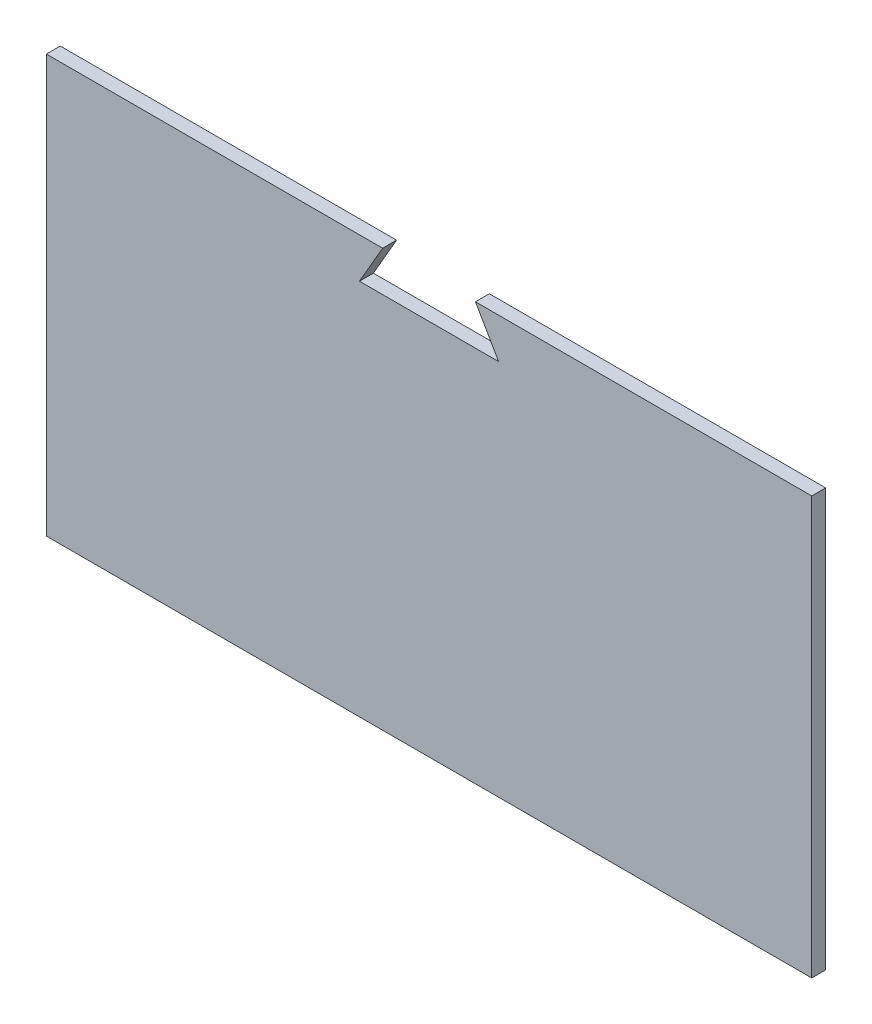
ISO-10303-21;
HEADER;
FILE_DESCRIPTION(('STEP AP214'),'2;1');
FILE_NAME('part.step','',(''),(''),'','','');
FILE_SCHEMA(('AUTOMOTIVE_DESIGN { 1 0 10303 214 1 1 1 1 }'));
ENDSEC;
DATA;
#1=APPLICATION_CONTEXT('core data for automotive mechanical design processes');
#2=APPLICATION_PROTOCOL_DEFINITION('international standard','automotive_design',2000,#1);
#3=PRODUCT_CONTEXT('',#1,'mechanical');
#4=PRODUCT('Part','Part','',(#3));
#5=PRODUCT_RELATED_PRODUCT_CATEGORY('part','',(#4));
#6=PRODUCT_DEFINITION_FORMATION('','',#4);
#7=PRODUCT_DEFINITION_CONTEXT('part definition',#1,'design');
#8=PRODUCT_DEFINITION('design','',#6,#7);
#9=PRODUCT_DEFINITION_SHAPE('','',#8);
#10=(LENGTH_UNIT() NAMED_UNIT(*) SI_UNIT(.MILLI.,.METRE.));
#11=(NAMED_UNIT(*) PLANE_ANGLE_UNIT() SI_UNIT($,.RADIAN.));
#12=(NAMED_UNIT(*) SI_UNIT($,.STERADIAN.) SOLID_ANGLE_UNIT());
#13=UNCERTAINTY_MEASURE_WITH_UNIT(LENGTH_MEASURE(1.E-05),#10,'distance_accuracy_value','');
#14=(GEOMETRIC_REPRESENTATION_CONTEXT(3) GLOBAL_UNCERTAINTY_ASSIGNED_CONTEXT((#13)) GLOBAL_UNIT_ASSIGNED_CONTEXT((#10,
#11,#12)) REPRESENTATION_CONTEXT('',''));
#15=CARTESIAN_POINT('',(0.,0.,0.));
#16=DIRECTION('',(0.,0.,1.));
#17=DIRECTION('',(1.,0.,0.));
#18=AXIS2_PLACEMENT_3D('',#15,#16,#17);
#19=CARTESIAN_POINT('',(-27.5,17.5,1.));
#20=DIRECTION('',(0.,-1.,0.));
#21=DIRECTION('',(0.,0.,-1.));
#22=AXIS2_PLACEMENT_3D('',#19,#20,#21);
#23=PLANE('',#22);
#24=DIRECTION('',(-1.,0.,0.));
#25=VECTOR('',#24,1.);
#26=CARTESIAN_POINT('',(-27.5,17.5,0.));
#27=LINE('',#26,#25);
#28=CARTESIAN_POINT('',(27.5,17.5,0.));
#29=VERTEX_POINT('',#28);
#30=CARTESIAN_POINT('',(3.33333333333333,17.5,0.));
#31=VERTEX_POINT('',#30);
#32=EDGE_CURVE('E150',#29,#31,#27,.T.);
#33=ORIENTED_EDGE('',*,*,#32,.T.);
#34=DIRECTION('',(0.,0.,1.));
#35=VECTOR('',#34,1.);
#36=CARTESIAN_POINT('',(3.33333333333333,17.5,1.));
#37=LINE('',#36,#35);
#38=CARTESIAN_POINT('',(3.33333333333333,17.5,1.));
#39=VERTEX_POINT('',#38);
#40=EDGE_CURVE('E120',#31,#39,#37,.T.);
#41=ORIENTED_EDGE('',*,*,#40,.T.);
#42=DIRECTION('',(-1.,0.,0.));
#43=VECTOR('',#42,1.);
#44=CARTESIAN_POINT('',(-27.5,17.5,1.));
#45=LINE('',#44,#43);
#46=CARTESIAN_POINT('',(27.5,17.5,1.));
#47=VERTEX_POINT('',#46);
#48=EDGE_CURVE('E86',#47,#39,#45,.T.);
#49=ORIENTED_EDGE('',*,*,#48,.F.);
#50=DIRECTION('',(0.,0.,-1.));
#51=VECTOR('',#50,1.);
#52=CARTESIAN_POINT('',(27.5,17.5,1.));
#53=LINE('',#52,#51);
#54=EDGE_CURVE('E41',#47,#29,#53,.T.);
#55=ORIENTED_EDGE('',*,*,#54,.T.);
#56=EDGE_LOOP('',(#33,#41,#49,#55));
#57=FACE_BOUND('',#56,.T.);
#58=ADVANCED_FACE('F33',(#57),#23,.F.);
#59=CARTESIAN_POINT('',(27.5,-12.5,1.));
#60=DIRECTION('',(-1.,0.,0.));
#61=DIRECTION('',(0.,0.,1.));
#62=AXIS2_PLACEMENT_3D('',#59,#60,#61);
#63=PLANE('',#62);
#64=DIRECTION('',(0.,1.,0.));
#65=VECTOR('',#64,1.);
#66=CARTESIAN_POINT('',(27.5,-12.5,0.));
#67=LINE('',#66,#65);
#68=CARTESIAN_POINT('',(27.5,-12.5,0.));
#69=VERTEX_POINT('',#68);
#70=EDGE_CURVE('E138',#69,#29,#67,.T.);
#71=ORIENTED_EDGE('',*,*,#70,.T.);
#72=ORIENTED_EDGE('',*,*,#54,.F.);
#73=DIRECTION('',(0.,1.,0.));
#74=VECTOR('',#73,1.);
#75=CARTESIAN_POINT('',(27.5,-12.5,1.));
#76=LINE('',#75,#74);
#77=CARTESIAN_POINT('',(27.5,-12.5,1.));
#78=VERTEX_POINT('',#77);
#79=EDGE_CURVE('E139',#78,#47,#76,.T.);
#80=ORIENTED_EDGE('',*,*,#79,.F.);
#81=DIRECTION('',(0.,0.,-1.));
#82=VECTOR('',#81,1.);
#83=CARTESIAN_POINT('',(27.5,-12.5,1.));
#84=LINE('',#83,#82);
#85=EDGE_CURVE('E146',#78,#69,#84,.T.);
#86=ORIENTED_EDGE('',*,*,#85,.T.);
#87=EDGE_LOOP('',(#71,#72,#80,#86));
#88=FACE_BOUND('',#87,.T.);
#89=ADVANCED_FACE('F35',(#88),#63,.F.);
#90=CARTESIAN_POINT('',(-3.33333333333334,17.5,1.));
#91=VERTEX_POINT('',#90);
#92=CARTESIAN_POINT('',(-27.5,17.5,1.));
#93=VERTEX_POINT('',#92);
#94=EDGE_CURVE('E141',#91,#93,#45,.T.);
#95=ORIENTED_EDGE('',*,*,#94,.F.);
#96=DIRECTION('',(0.,0.,-1.));
#97=VECTOR('',#96,1.);
#98=CARTESIAN_POINT('',(-3.33333333333334,17.5,1.));
#99=LINE('',#98,#97);
#100=CARTESIAN_POINT('',(-3.33333333333334,17.5,0.));
#101=VERTEX_POINT('',#100);
#102=EDGE_CURVE('E114',#91,#101,#99,.T.);
#103=ORIENTED_EDGE('',*,*,#102,.T.);
#104=CARTESIAN_POINT('',(-27.5,17.5,0.));
#105=VERTEX_POINT('',#104);
#106=EDGE_CURVE('E149',#101,#105,#27,.T.);
#107=ORIENTED_EDGE('',*,*,#106,.T.);
#108=DIRECTION('',(0.,0.,-1.));
#109=VECTOR('',#108,1.);
#110=CARTESIAN_POINT('',(-27.5,17.5,1.));
#111=LINE('',#110,#109);
#112=EDGE_CURVE('E158',#93,#105,#111,.T.);
#113=ORIENTED_EDGE('',*,*,#112,.F.);
#114=EDGE_LOOP('',(#95,#103,#107,#113));
#115=FACE_BOUND('',#114,.T.);
#116=ADVANCED_FACE('F176',(#115),#23,.F.);
#117=CARTESIAN_POINT('',(-27.5,-12.5,1.));
#118=DIRECTION('',(1.,0.,0.));
#119=DIRECTION('',(0.,0.,-1.));
#120=AXIS2_PLACEMENT_3D('',#117,#118,#119);
#121=PLANE('',#120);
#122=DIRECTION('',(0.,-1.,0.));
#123=VECTOR('',#122,1.);
#124=CARTESIAN_POINT('',(-27.5,-12.5,0.));
#125=LINE('',#124,#123);
#126=CARTESIAN_POINT('',(-27.5,-12.5,0.));
#127=VERTEX_POINT('',#126);
#128=EDGE_CURVE('E152',#105,#127,#125,.T.);
#129=ORIENTED_EDGE('',*,*,#128,.T.);
#130=DIRECTION('',(0.,0.,-1.));
#131=VECTOR('',#130,1.);
#132=CARTESIAN_POINT('',(-27.5,-12.5,1.));
#133=LINE('',#132,#131);
#134=CARTESIAN_POINT('',(-27.5,-12.5,1.));
#135=VERTEX_POINT('',#134);
#136=EDGE_CURVE('E156',#135,#127,#133,.T.);
#137=ORIENTED_EDGE('',*,*,#136,.F.);
#138=DIRECTION('',(0.,-1.,0.));
#139=VECTOR('',#138,1.);
#140=CARTESIAN_POINT('',(-27.5,-12.5,1.));
#141=LINE('',#140,#139);
#142=EDGE_CURVE('E143',#93,#135,#141,.T.);
#143=ORIENTED_EDGE('',*,*,#142,.F.);
#144=ORIENTED_EDGE('',*,*,#112,.T.);
#145=EDGE_LOOP('',(#129,#137,#143,#144));
#146=FACE_BOUND('',#145,.T.);
#147=ADVANCED_FACE('F167',(#146),#121,.F.);
#148=CARTESIAN_POINT('',(-27.5,-12.5,1.));
#149=DIRECTION('',(0.,1.,0.));
#150=DIRECTION('',(0.,0.,1.));
#151=AXIS2_PLACEMENT_3D('',#148,#149,#150);
#152=PLANE('',#151);
#153=DIRECTION('',(1.,0.,0.));
#154=VECTOR('',#153,1.);
#155=CARTESIAN_POINT('',(-27.5,-12.5,0.));
#156=LINE('',#155,#154);
#157=EDGE_CURVE('E78',#127,#69,#156,.T.);
#158=ORIENTED_EDGE('',*,*,#157,.T.);
#159=ORIENTED_EDGE('',*,*,#85,.F.);
#160=DIRECTION('',(1.,0.,0.));
#161=VECTOR('',#160,1.);
#162=CARTESIAN_POINT('',(-27.5,-12.5,1.));
#163=LINE('',#162,#161);
#164=EDGE_CURVE('E57',#135,#78,#163,.T.);
#165=ORIENTED_EDGE('',*,*,#164,.F.);
#166=ORIENTED_EDGE('',*,*,#136,.T.);
#167=EDGE_LOOP('',(#158,#159,#165,#166));
#168=FACE_BOUND('',#167,.T.);
#169=ADVANCED_FACE('F170',(#168),#152,.F.);
#170=CARTESIAN_POINT('',(0.,0.,1.));
#171=DIRECTION('',(0.,0.,-1.));
#172=DIRECTION('',(-1.,0.,0.));
#173=AXIS2_PLACEMENT_3D('',#170,#171,#172);
#174=PLANE('',#173);
#175=ORIENTED_EDGE('',*,*,#48,.T.);
#176=DIRECTION('',(-0.5,0.866025403784439,0.));
#177=VECTOR('',#176,1.);
#178=CARTESIAN_POINT('',(4.99999999999999,14.6132486540519,1.));
#179=LINE('',#178,#177);
#180=CARTESIAN_POINT('',(4.99999999999999,14.6132486540519,1.));
#181=VERTEX_POINT('',#180);
#182=EDGE_CURVE('E130',#181,#39,#179,.T.);
#183=ORIENTED_EDGE('',*,*,#182,.F.);
#184=DIRECTION('',(1.,0.,0.));
#185=VECTOR('',#184,1.);
#186=CARTESIAN_POINT('',(-5.,14.6132486540519,1.));
#187=LINE('',#186,#185);
#188=CARTESIAN_POINT('',(-5.,14.6132486540519,1.));
#189=VERTEX_POINT('',#188);
#190=EDGE_CURVE('E111',#189,#181,#187,.T.);
#191=ORIENTED_EDGE('',*,*,#190,.F.);
#192=DIRECTION('',(-0.5,-0.866025403784439,0.));
#193=VECTOR('',#192,1.);
#194=CARTESIAN_POINT('',(0.,23.2735026918963,1.));
#195=LINE('',#194,#193);
#196=EDGE_CURVE('E132',#91,#189,#195,.T.);
#197=ORIENTED_EDGE('',*,*,#196,.F.);
#198=ORIENTED_EDGE('',*,*,#94,.T.);
#199=ORIENTED_EDGE('',*,*,#142,.T.);
#200=ORIENTED_EDGE('',*,*,#164,.T.);
#201=ORIENTED_EDGE('',*,*,#79,.T.);
#202=EDGE_LOOP('',(#175,#183,#191,#197,#198,#199,#200,#201));
#203=FACE_BOUND('',#202,.T.);
#204=ADVANCED_FACE('F171',(#203),#174,.F.);
#205=CARTESIAN_POINT('',(0.,0.,0.));
#206=DIRECTION('',(0.,0.,-1.));
#207=DIRECTION('',(-1.,0.,0.));
#208=AXIS2_PLACEMENT_3D('',#205,#206,#207);
#209=PLANE('',#208);
#210=DIRECTION('',(-0.5,0.866025403784439,0.));
#211=VECTOR('',#210,1.);
#212=CARTESIAN_POINT('',(4.99999999999999,14.6132486540519,0.));
#213=LINE('',#212,#211);
#214=CARTESIAN_POINT('',(4.99999999999999,14.6132486540519,0.));
#215=VERTEX_POINT('',#214);
#216=EDGE_CURVE('E118',#215,#31,#213,.T.);
#217=ORIENTED_EDGE('',*,*,#216,.T.);
#218=ORIENTED_EDGE('',*,*,#32,.F.);
#219=ORIENTED_EDGE('',*,*,#70,.F.);
#220=ORIENTED_EDGE('',*,*,#157,.F.);
#221=ORIENTED_EDGE('',*,*,#128,.F.);
#222=ORIENTED_EDGE('',*,*,#106,.F.);
#223=DIRECTION('',(0.5,0.866025403784439,0.));
#224=VECTOR('',#223,1.);
#225=CARTESIAN_POINT('',(-10.0777222831138,5.81837567297406,0.));
#226=LINE('',#225,#224);
#227=CARTESIAN_POINT('',(-5.,14.6132486540519,0.));
#228=VERTEX_POINT('',#227);
#229=EDGE_CURVE('E11',#228,#101,#226,.T.);
#230=ORIENTED_EDGE('',*,*,#229,.F.);
#231=DIRECTION('',(1.,0.,0.));
#232=VECTOR('',#231,1.);
#233=CARTESIAN_POINT('',(-5.,14.6132486540519,0.));
#234=LINE('',#233,#232);
#235=EDGE_CURVE('E48',#228,#215,#234,.T.);
#236=ORIENTED_EDGE('',*,*,#235,.T.);
#237=EDGE_LOOP('',(#217,#218,#219,#220,#221,#222,#230,#236));
#238=FACE_BOUND('',#237,.T.);
#239=ADVANCED_FACE('F125',(#238),#209,.T.);
#240=CARTESIAN_POINT('',(4.99999999999999,14.6132486540519,0.));
#241=DIRECTION('',(0.866025403784439,0.5,0.));
#242=DIRECTION('',(-0.5,0.866025403784439,0.));
#243=AXIS2_PLACEMENT_3D('',#240,#241,#242);
#244=PLANE('',#243);
#245=ORIENTED_EDGE('',*,*,#216,.F.);
#246=DIRECTION('',(0.,0.,1.));
#247=VECTOR('',#246,1.);
#248=CARTESIAN_POINT('',(4.99999999999999,14.6132486540519,0.));
#249=LINE('',#248,#247);
#250=EDGE_CURVE('E107',#215,#181,#249,.T.);
#251=ORIENTED_EDGE('',*,*,#250,.T.);
#252=ORIENTED_EDGE('',*,*,#182,.T.);
#253=ORIENTED_EDGE('',*,*,#40,.F.);
#254=EDGE_LOOP('',(#245,#251,#252,#253));
#255=FACE_BOUND('',#254,.T.);
#256=ADVANCED_FACE('F119',(#255),#244,.F.);
#257=CARTESIAN_POINT('',(0.,23.2735026918963,0.));
#258=DIRECTION('',(-0.866025403784439,0.5,0.));
#259=DIRECTION('',(-0.5,-0.866025403784439,0.));
#260=AXIS2_PLACEMENT_3D('',#257,#258,#259);
#261=PLANE('',#260);
#262=ORIENTED_EDGE('',*,*,#196,.T.);
#263=DIRECTION('',(0.,0.,1.));
#264=VECTOR('',#263,1.);
#265=CARTESIAN_POINT('',(-5.,14.6132486540519,0.));
#266=LINE('',#265,#264);
#267=EDGE_CURVE('E115',#228,#189,#266,.T.);
#268=ORIENTED_EDGE('',*,*,#267,.F.);
#269=ORIENTED_EDGE('',*,*,#229,.T.);
#270=ORIENTED_EDGE('',*,*,#102,.F.);
#271=EDGE_LOOP('',(#262,#268,#269,#270));
#272=FACE_BOUND('',#271,.T.);
#273=ADVANCED_FACE('F177',(#272),#261,.F.);
#274=CARTESIAN_POINT('',(-5.,14.6132486540519,0.));
#275=DIRECTION('',(0.,-1.,0.));
#276=DIRECTION('',(1.,0.,0.));
#277=AXIS2_PLACEMENT_3D('',#274,#275,#276);
#278=PLANE('',#277);
#279=ORIENTED_EDGE('',*,*,#190,.T.);
#280=ORIENTED_EDGE('',*,*,#250,.F.);
#281=ORIENTED_EDGE('',*,*,#235,.F.);
#282=ORIENTED_EDGE('',*,*,#267,.T.);
#283=EDGE_LOOP('',(#279,#280,#281,#282));
#284=FACE_BOUND('',#283,.T.);
#285=ADVANCED_FACE('F109',(#284),#278,.F.);
#286=CLOSED_SHELL('',(#58,#89,#116,#147,#169,#204,#239,#256,#273,#285));
#287=MANIFOLD_SOLID_BREP('B2',#286);
#288=ADVANCED_BREP_SHAPE_REPRESENTATION('',(#18,#287),#14);
#289=SHAPE_DEFINITION_REPRESENTATION(#9,#288);
ENDSEC;
END-ISO-10303-21;
